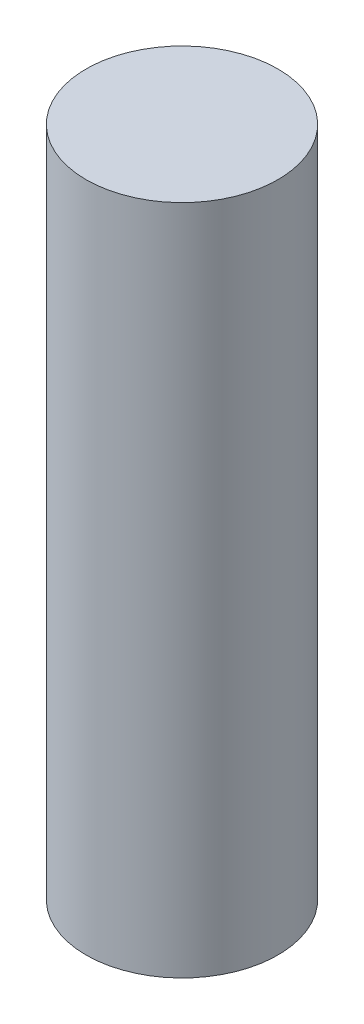
ISO-10303-21;
HEADER;
FILE_DESCRIPTION(('STEP AP214'),'2;1');
FILE_NAME('part.step','',(''),(''),'','','');
FILE_SCHEMA(('AUTOMOTIVE_DESIGN { 1 0 10303 214 1 1 1 1 }'));
ENDSEC;
DATA;
#1=APPLICATION_CONTEXT('core data for automotive mechanical design processes');
#2=APPLICATION_PROTOCOL_DEFINITION('international standard','automotive_design',2000,#1);
#3=PRODUCT_CONTEXT('',#1,'mechanical');
#4=PRODUCT('Part','Part','',(#3));
#5=PRODUCT_RELATED_PRODUCT_CATEGORY('part','',(#4));
#6=PRODUCT_DEFINITION_FORMATION('','',#4);
#7=PRODUCT_DEFINITION_CONTEXT('part definition',#1,'design');
#8=PRODUCT_DEFINITION('design','',#6,#7);
#9=PRODUCT_DEFINITION_SHAPE('','',#8);
#10=(LENGTH_UNIT() NAMED_UNIT(*) SI_UNIT(.MILLI.,.METRE.));
#11=(NAMED_UNIT(*) PLANE_ANGLE_UNIT() SI_UNIT($,.RADIAN.));
#12=(NAMED_UNIT(*) SI_UNIT($,.STERADIAN.) SOLID_ANGLE_UNIT());
#13=UNCERTAINTY_MEASURE_WITH_UNIT(LENGTH_MEASURE(1.E-05),#10,'distance_accuracy_value','');
#14=(GEOMETRIC_REPRESENTATION_CONTEXT(3) GLOBAL_UNCERTAINTY_ASSIGNED_CONTEXT((#13)) GLOBAL_UNIT_ASSIGNED_CONTEXT((#10,
#11,#12)) REPRESENTATION_CONTEXT('',''));
#15=CARTESIAN_POINT('',(0.,0.,0.));
#16=DIRECTION('',(0.,0.,1.));
#17=DIRECTION('',(1.,0.,0.));
#18=AXIS2_PLACEMENT_3D('',#15,#16,#17);
#19=CARTESIAN_POINT('',(-6.93043581559333,7.,-2.14597251142738));
#20=DIRECTION('',(0.,-1.,0.));
#21=DIRECTION('',(0.,0.,-1.));
#22=AXIS2_PLACEMENT_3D('',#19,#20,#21);
#23=CYLINDRICAL_SURFACE('',#22,1.);
#24=CARTESIAN_POINT('',(-6.93043581559333,7.,-2.14597251142738));
#25=DIRECTION('',(0.,1.,0.));
#26=DIRECTION('',(0.,0.,1.));
#27=AXIS2_PLACEMENT_3D('',#24,#25,#26);
#28=CIRCLE('',#27,1.);
#29=CARTESIAN_POINT('',(-6.93043581559333,7.,-1.14597251142738));
#30=VERTEX_POINT('',#29);
#31=EDGE_CURVE('E10',#30,#30,#28,.T.);
#32=ORIENTED_EDGE('',*,*,#31,.F.);
#33=EDGE_LOOP('',(#32));
#34=FACE_BOUND('',#33,.T.);
#35=CARTESIAN_POINT('',(-6.93043581559333,0.,-2.14597251142738));
#36=DIRECTION('',(0.,1.,0.));
#37=DIRECTION('',(0.,0.,1.));
#38=AXIS2_PLACEMENT_3D('',#35,#36,#37);
#39=CIRCLE('',#38,1.);
#40=CARTESIAN_POINT('',(-6.93043581559333,0.,-1.14597251142738));
#41=VERTEX_POINT('',#40);
#42=EDGE_CURVE('E40',#41,#41,#39,.T.);
#43=ORIENTED_EDGE('',*,*,#42,.T.);
#44=EDGE_LOOP('',(#43));
#45=FACE_BOUND('',#44,.T.);
#46=ADVANCED_FACE('F37',(#34,#45),#23,.T.);
#47=CARTESIAN_POINT('',(-6.93043581559333,7.,-2.14597251142738));
#48=DIRECTION('',(0.,1.,0.));
#49=DIRECTION('',(0.,0.,1.));
#50=AXIS2_PLACEMENT_3D('',#47,#48,#49);
#51=PLANE('',#50);
#52=ORIENTED_EDGE('',*,*,#31,.T.);
#53=EDGE_LOOP('',(#52));
#54=FACE_BOUND('',#53,.T.);
#55=ADVANCED_FACE('F54',(#54),#51,.T.);
#56=CARTESIAN_POINT('',(-6.93043581559333,0.,-2.14597251142738));
#57=DIRECTION('',(0.,1.,0.));
#58=DIRECTION('',(0.,0.,1.));
#59=AXIS2_PLACEMENT_3D('',#56,#57,#58);
#60=PLANE('',#59);
#61=ORIENTED_EDGE('',*,*,#42,.F.);
#62=EDGE_LOOP('',(#61));
#63=FACE_BOUND('',#62,.T.);
#64=ADVANCED_FACE('F52',(#63),#60,.F.);
#65=CLOSED_SHELL('',(#46,#55,#64));
#66=MANIFOLD_SOLID_BREP('B2',#65);
#67=ADVANCED_BREP_SHAPE_REPRESENTATION('',(#18,#66),#14);
#68=SHAPE_DEFINITION_REPRESENTATION(#9,#67);
ENDSEC;
END-ISO-10303-21;
